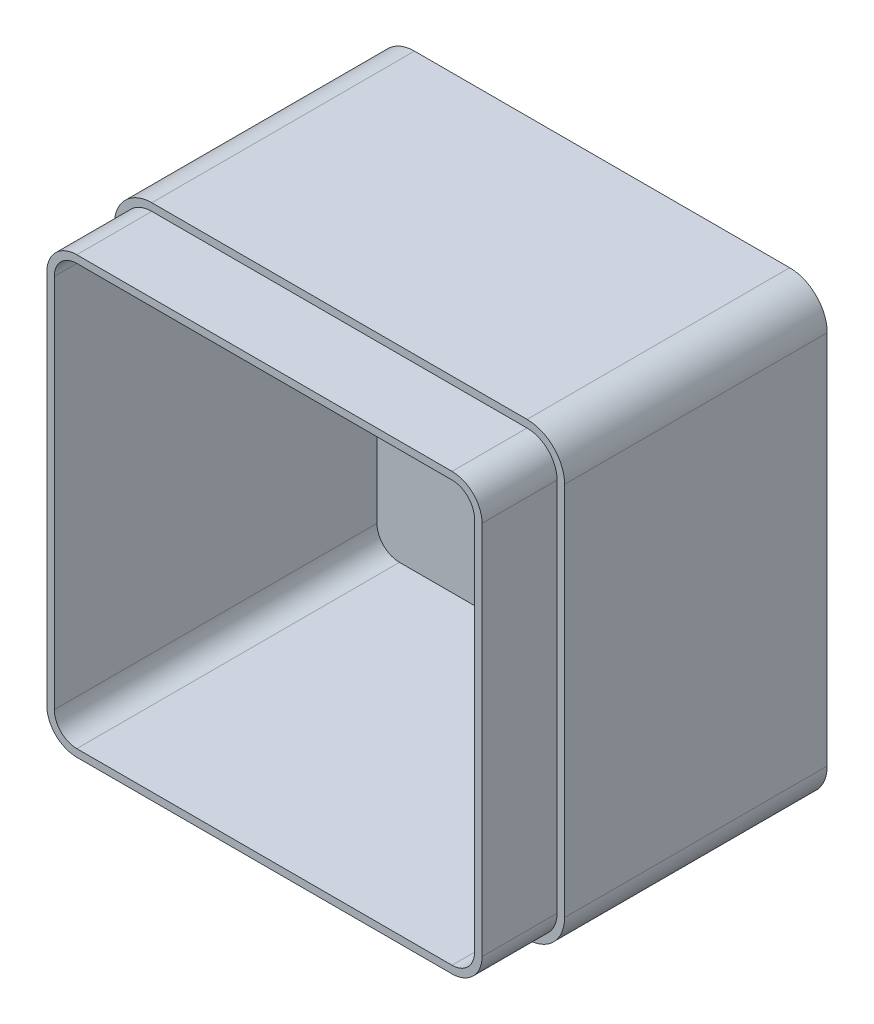
ISO-10303-21;
HEADER;
FILE_DESCRIPTION(('STEP AP214'),'2;1');
FILE_NAME('part.step','',(''),(''),'','','');
FILE_SCHEMA(('AUTOMOTIVE_DESIGN { 1 0 10303 214 1 1 1 1 }'));
ENDSEC;
DATA;
#1=APPLICATION_CONTEXT('core data for automotive mechanical design processes');
#2=APPLICATION_PROTOCOL_DEFINITION('international standard','automotive_design',2000,#1);
#3=PRODUCT_CONTEXT('',#1,'mechanical');
#4=PRODUCT('Part','Part','',(#3));
#5=PRODUCT_RELATED_PRODUCT_CATEGORY('part','',(#4));
#6=PRODUCT_DEFINITION_FORMATION('','',#4);
#7=PRODUCT_DEFINITION_CONTEXT('part definition',#1,'design');
#8=PRODUCT_DEFINITION('design','',#6,#7);
#9=PRODUCT_DEFINITION_SHAPE('','',#8);
#10=(LENGTH_UNIT() NAMED_UNIT(*) SI_UNIT(.MILLI.,.METRE.));
#11=(NAMED_UNIT(*) PLANE_ANGLE_UNIT() SI_UNIT($,.RADIAN.));
#12=(NAMED_UNIT(*) SI_UNIT($,.STERADIAN.) SOLID_ANGLE_UNIT());
#13=UNCERTAINTY_MEASURE_WITH_UNIT(LENGTH_MEASURE(1.E-05),#10,'distance_accuracy_value','');
#14=(GEOMETRIC_REPRESENTATION_CONTEXT(3) GLOBAL_UNCERTAINTY_ASSIGNED_CONTEXT((#13)) GLOBAL_UNIT_ASSIGNED_CONTEXT((#10,
#11,#12)) REPRESENTATION_CONTEXT('',''));
#15=CARTESIAN_POINT('',(0.,0.,0.));
#16=DIRECTION('',(0.,0.,1.));
#17=DIRECTION('',(1.,0.,0.));
#18=AXIS2_PLACEMENT_3D('',#15,#16,#17);
#19=CARTESIAN_POINT('',(0.,0.,90.));
#20=DIRECTION('',(0.,0.,-1.));
#21=DIRECTION('',(-1.,0.,0.));
#22=AXIS2_PLACEMENT_3D('',#19,#20,#21);
#23=PLANE('',#22);
#24=DIRECTION('',(0.,-1.,0.));
#25=VECTOR('',#24,1.);
#26=CARTESIAN_POINT('',(4.,0.,90.));
#27=LINE('',#26,#25);
#28=CARTESIAN_POINT('',(4.,110.,90.));
#29=VERTEX_POINT('',#28);
#30=CARTESIAN_POINT('',(4.,9.99999999999999,90.));
#31=VERTEX_POINT('',#30);
#32=EDGE_CURVE('E347',#29,#31,#27,.T.);
#33=ORIENTED_EDGE('',*,*,#32,.F.);
#34=CARTESIAN_POINT('',(10.,110.,90.));
#35=DIRECTION('',(0.,0.,-1.));
#36=DIRECTION('',(-1.,0.,0.));
#37=AXIS2_PLACEMENT_3D('',#34,#35,#36);
#38=CIRCLE('',#37,6.);
#39=CARTESIAN_POINT('',(9.99999999999999,116.,90.));
#40=VERTEX_POINT('',#39);
#41=EDGE_CURVE('E387',#40,#29,#38,.F.);
#42=ORIENTED_EDGE('',*,*,#41,.F.);
#43=DIRECTION('',(-1.,0.,0.));
#44=VECTOR('',#43,1.);
#45=CARTESIAN_POINT('',(0.,116.,90.));
#46=LINE('',#45,#44);
#47=CARTESIAN_POINT('',(110.,116.,90.));
#48=VERTEX_POINT('',#47);
#49=EDGE_CURVE('E363',#48,#40,#46,.T.);
#50=ORIENTED_EDGE('',*,*,#49,.F.);
#51=CARTESIAN_POINT('',(110.,110.,90.));
#52=DIRECTION('',(0.,0.,-1.));
#53=DIRECTION('',(-1.,0.,0.));
#54=AXIS2_PLACEMENT_3D('',#51,#52,#53);
#55=CIRCLE('',#54,6.);
#56=CARTESIAN_POINT('',(116.,110.,90.));
#57=VERTEX_POINT('',#56);
#58=EDGE_CURVE('E327',#57,#48,#55,.F.);
#59=ORIENTED_EDGE('',*,*,#58,.F.);
#60=DIRECTION('',(0.,1.,0.));
#61=VECTOR('',#60,1.);
#62=CARTESIAN_POINT('',(116.,0.,90.));
#63=LINE('',#62,#61);
#64=CARTESIAN_POINT('',(116.,9.99999999999999,90.));
#65=VERTEX_POINT('',#64);
#66=EDGE_CURVE('E391',#65,#57,#63,.T.);
#67=ORIENTED_EDGE('',*,*,#66,.F.);
#68=CARTESIAN_POINT('',(110.,10.,90.));
#69=DIRECTION('',(0.,0.,-1.));
#70=DIRECTION('',(-1.,0.,0.));
#71=AXIS2_PLACEMENT_3D('',#68,#69,#70);
#72=CIRCLE('',#71,6.);
#73=CARTESIAN_POINT('',(110.,4.,90.));
#74=VERTEX_POINT('',#73);
#75=EDGE_CURVE('E392',#74,#65,#72,.F.);
#76=ORIENTED_EDGE('',*,*,#75,.F.);
#77=DIRECTION('',(1.,0.,0.));
#78=VECTOR('',#77,1.);
#79=CARTESIAN_POINT('',(0.,4.,90.));
#80=LINE('',#79,#78);
#81=CARTESIAN_POINT('',(9.99999999999999,4.,90.));
#82=VERTEX_POINT('',#81);
#83=EDGE_CURVE('E384',#82,#74,#80,.T.);
#84=ORIENTED_EDGE('',*,*,#83,.F.);
#85=CARTESIAN_POINT('',(10.,10.,90.));
#86=DIRECTION('',(0.,0.,-1.));
#87=DIRECTION('',(-1.,0.,0.));
#88=AXIS2_PLACEMENT_3D('',#85,#86,#87);
#89=CIRCLE('',#88,6.);
#90=EDGE_CURVE('E377',#31,#82,#89,.F.);
#91=ORIENTED_EDGE('',*,*,#90,.F.);
#92=EDGE_LOOP('',(#33,#42,#50,#59,#67,#76,#84,#91));
#93=FACE_BOUND('',#92,.T.);
#94=CARTESIAN_POINT('',(10.,110.,90.));
#95=DIRECTION('',(0.,0.,1.));
#96=DIRECTION('',(1.,0.,0.));
#97=AXIS2_PLACEMENT_3D('',#94,#95,#96);
#98=CIRCLE('',#97,8.);
#99=CARTESIAN_POINT('',(9.99999999999999,118.,90.));
#100=VERTEX_POINT('',#99);
#101=CARTESIAN_POINT('',(2.,110.,90.));
#102=VERTEX_POINT('',#101);
#103=EDGE_CURVE('E255',#100,#102,#98,.T.);
#104=ORIENTED_EDGE('',*,*,#103,.T.);
#105=DIRECTION('',(0.,-1.,0.));
#106=VECTOR('',#105,1.);
#107=CARTESIAN_POINT('',(2.,110.,90.));
#108=LINE('',#107,#106);
#109=CARTESIAN_POINT('',(2.,9.99999999999999,90.));
#110=VERTEX_POINT('',#109);
#111=EDGE_CURVE('E205',#102,#110,#108,.T.);
#112=ORIENTED_EDGE('',*,*,#111,.T.);
#113=CARTESIAN_POINT('',(10.,10.,90.));
#114=DIRECTION('',(0.,0.,1.));
#115=DIRECTION('',(1.,0.,0.));
#116=AXIS2_PLACEMENT_3D('',#113,#114,#115);
#117=CIRCLE('',#116,8.);
#118=CARTESIAN_POINT('',(9.99999999999999,2.,90.));
#119=VERTEX_POINT('',#118);
#120=EDGE_CURVE('E54',#110,#119,#117,.T.);
#121=ORIENTED_EDGE('',*,*,#120,.T.);
#122=DIRECTION('',(1.,0.,0.));
#123=VECTOR('',#122,1.);
#124=CARTESIAN_POINT('',(9.99999999999999,2.,90.));
#125=LINE('',#124,#123);
#126=CARTESIAN_POINT('',(110.,2.,90.));
#127=VERTEX_POINT('',#126);
#128=EDGE_CURVE('E262',#119,#127,#125,.T.);
#129=ORIENTED_EDGE('',*,*,#128,.T.);
#130=CARTESIAN_POINT('',(110.,10.,90.));
#131=DIRECTION('',(0.,0.,1.));
#132=DIRECTION('',(1.,0.,0.));
#133=AXIS2_PLACEMENT_3D('',#130,#131,#132);
#134=CIRCLE('',#133,7.99999999999999);
#135=CARTESIAN_POINT('',(118.,10.,90.));
#136=VERTEX_POINT('',#135);
#137=EDGE_CURVE('E266',#127,#136,#134,.T.);
#138=ORIENTED_EDGE('',*,*,#137,.T.);
#139=DIRECTION('',(0.,1.,0.));
#140=VECTOR('',#139,1.);
#141=CARTESIAN_POINT('',(118.,9.99999999999999,90.));
#142=LINE('',#141,#140);
#143=CARTESIAN_POINT('',(118.,110.,90.));
#144=VERTEX_POINT('',#143);
#145=EDGE_CURVE('E270',#136,#144,#142,.T.);
#146=ORIENTED_EDGE('',*,*,#145,.T.);
#147=CARTESIAN_POINT('',(110.,110.,90.));
#148=DIRECTION('',(0.,0.,1.));
#149=DIRECTION('',(1.,0.,0.));
#150=AXIS2_PLACEMENT_3D('',#147,#148,#149);
#151=CIRCLE('',#150,7.99999999999999);
#152=CARTESIAN_POINT('',(110.,118.,90.));
#153=VERTEX_POINT('',#152);
#154=EDGE_CURVE('E232',#144,#153,#151,.T.);
#155=ORIENTED_EDGE('',*,*,#154,.T.);
#156=DIRECTION('',(-1.,0.,0.));
#157=VECTOR('',#156,1.);
#158=CARTESIAN_POINT('',(110.,118.,90.));
#159=LINE('',#158,#157);
#160=EDGE_CURVE('E228',#153,#100,#159,.T.);
#161=ORIENTED_EDGE('',*,*,#160,.T.);
#162=EDGE_LOOP('',(#104,#112,#121,#129,#138,#146,#155,#161));
#163=FACE_BOUND('',#162,.T.);
#164=ADVANCED_FACE('F38',(#93,#163),#23,.F.);
#165=CARTESIAN_POINT('',(4.,0.,90.));
#166=DIRECTION('',(1.,0.,0.));
#167=DIRECTION('',(0.,0.,-1.));
#168=AXIS2_PLACEMENT_3D('',#165,#166,#167);
#169=PLANE('',#168);
#170=DIRECTION('',(0.,-1.,0.));
#171=VECTOR('',#170,1.);
#172=CARTESIAN_POINT('',(4.,0.,4.));
#173=LINE('',#172,#171);
#174=CARTESIAN_POINT('',(4.,110.,4.));
#175=VERTEX_POINT('',#174);
#176=CARTESIAN_POINT('',(4.,9.99999999999999,4.));
#177=VERTEX_POINT('',#176);
#178=EDGE_CURVE('E319',#175,#177,#173,.T.);
#179=ORIENTED_EDGE('',*,*,#178,.F.);
#180=DIRECTION('',(0.,0.,-1.));
#181=VECTOR('',#180,1.);
#182=CARTESIAN_POINT('',(4.,110.,90.));
#183=LINE('',#182,#181);
#184=EDGE_CURVE('E328',#29,#175,#183,.T.);
#185=ORIENTED_EDGE('',*,*,#184,.F.);
#186=ORIENTED_EDGE('',*,*,#32,.T.);
#187=DIRECTION('',(0.,0.,-1.));
#188=VECTOR('',#187,1.);
#189=CARTESIAN_POINT('',(4.,9.99999999999999,90.));
#190=LINE('',#189,#188);
#191=EDGE_CURVE('E324',#177,#31,#190,.F.);
#192=ORIENTED_EDGE('',*,*,#191,.F.);
#193=EDGE_LOOP('',(#179,#185,#186,#192));
#194=FACE_BOUND('',#193,.T.);
#195=ADVANCED_FACE('F505',(#194),#169,.T.);
#196=CARTESIAN_POINT('',(0.,4.,90.));
#197=DIRECTION('',(0.,1.,0.));
#198=DIRECTION('',(0.,0.,1.));
#199=AXIS2_PLACEMENT_3D('',#196,#197,#198);
#200=PLANE('',#199);
#201=ORIENTED_EDGE('',*,*,#83,.T.);
#202=DIRECTION('',(0.,0.,1.));
#203=VECTOR('',#202,1.);
#204=CARTESIAN_POINT('',(110.,4.,90.));
#205=LINE('',#204,#203);
#206=CARTESIAN_POINT('',(110.,4.,4.));
#207=VERTEX_POINT('',#206);
#208=EDGE_CURVE('E360',#207,#74,#205,.T.);
#209=ORIENTED_EDGE('',*,*,#208,.F.);
#210=DIRECTION('',(1.,0.,0.));
#211=VECTOR('',#210,1.);
#212=CARTESIAN_POINT('',(0.,4.,4.));
#213=LINE('',#212,#211);
#214=CARTESIAN_POINT('',(9.99999999999999,4.,4.));
#215=VERTEX_POINT('',#214);
#216=EDGE_CURVE('E323',#215,#207,#213,.T.);
#217=ORIENTED_EDGE('',*,*,#216,.F.);
#218=DIRECTION('',(0.,0.,1.));
#219=VECTOR('',#218,1.);
#220=CARTESIAN_POINT('',(9.99999999999999,4.,90.));
#221=LINE('',#220,#219);
#222=EDGE_CURVE('E351',#82,#215,#221,.F.);
#223=ORIENTED_EDGE('',*,*,#222,.F.);
#224=EDGE_LOOP('',(#201,#209,#217,#223));
#225=FACE_BOUND('',#224,.T.);
#226=ADVANCED_FACE('F511',(#225),#200,.T.);
#227=CARTESIAN_POINT('',(116.,0.,90.));
#228=DIRECTION('',(-1.,0.,0.));
#229=DIRECTION('',(0.,0.,1.));
#230=AXIS2_PLACEMENT_3D('',#227,#228,#229);
#231=PLANE('',#230);
#232=ORIENTED_EDGE('',*,*,#66,.T.);
#233=DIRECTION('',(0.,0.,1.));
#234=VECTOR('',#233,1.);
#235=CARTESIAN_POINT('',(116.,110.,90.));
#236=LINE('',#235,#234);
#237=CARTESIAN_POINT('',(116.,110.,4.));
#238=VERTEX_POINT('',#237);
#239=EDGE_CURVE('E369',#238,#57,#236,.T.);
#240=ORIENTED_EDGE('',*,*,#239,.F.);
#241=DIRECTION('',(0.,1.,0.));
#242=VECTOR('',#241,1.);
#243=CARTESIAN_POINT('',(116.,0.,4.));
#244=LINE('',#243,#242);
#245=CARTESIAN_POINT('',(116.,9.99999999999999,4.));
#246=VERTEX_POINT('',#245);
#247=EDGE_CURVE('E336',#246,#238,#244,.T.);
#248=ORIENTED_EDGE('',*,*,#247,.F.);
#249=DIRECTION('',(0.,0.,1.));
#250=VECTOR('',#249,1.);
#251=CARTESIAN_POINT('',(116.,9.99999999999999,90.));
#252=LINE('',#251,#250);
#253=EDGE_CURVE('E364',#65,#246,#252,.F.);
#254=ORIENTED_EDGE('',*,*,#253,.F.);
#255=EDGE_LOOP('',(#232,#240,#248,#254));
#256=FACE_BOUND('',#255,.T.);
#257=ADVANCED_FACE('F540',(#256),#231,.T.);
#258=CARTESIAN_POINT('',(0.,116.,90.));
#259=DIRECTION('',(0.,-1.,0.));
#260=DIRECTION('',(0.,0.,-1.));
#261=AXIS2_PLACEMENT_3D('',#258,#259,#260);
#262=PLANE('',#261);
#263=DIRECTION('',(-1.,0.,0.));
#264=VECTOR('',#263,1.);
#265=CARTESIAN_POINT('',(0.,116.,4.));
#266=LINE('',#265,#264);
#267=CARTESIAN_POINT('',(110.,116.,4.));
#268=VERTEX_POINT('',#267);
#269=CARTESIAN_POINT('',(9.99999999999999,116.,4.));
#270=VERTEX_POINT('',#269);
#271=EDGE_CURVE('E343',#268,#270,#266,.T.);
#272=ORIENTED_EDGE('',*,*,#271,.F.);
#273=DIRECTION('',(0.,0.,-1.));
#274=VECTOR('',#273,1.);
#275=CARTESIAN_POINT('',(110.,116.,90.));
#276=LINE('',#275,#274);
#277=EDGE_CURVE('E373',#48,#268,#276,.T.);
#278=ORIENTED_EDGE('',*,*,#277,.F.);
#279=ORIENTED_EDGE('',*,*,#49,.T.);
#280=DIRECTION('',(0.,0.,-1.));
#281=VECTOR('',#280,1.);
#282=CARTESIAN_POINT('',(9.99999999999999,116.,90.));
#283=LINE('',#282,#281);
#284=EDGE_CURVE('E372',#270,#40,#283,.F.);
#285=ORIENTED_EDGE('',*,*,#284,.F.);
#286=EDGE_LOOP('',(#272,#278,#279,#285));
#287=FACE_BOUND('',#286,.T.);
#288=ADVANCED_FACE('F536',(#287),#262,.T.);
#289=CARTESIAN_POINT('',(0.,0.,4.));
#290=DIRECTION('',(0.,0.,-1.));
#291=DIRECTION('',(-1.,0.,0.));
#292=AXIS2_PLACEMENT_3D('',#289,#290,#291);
#293=PLANE('',#292);
#294=ORIENTED_EDGE('',*,*,#216,.T.);
#295=CARTESIAN_POINT('',(110.,10.,4.));
#296=DIRECTION('',(0.,0.,-1.));
#297=DIRECTION('',(-1.,0.,0.));
#298=AXIS2_PLACEMENT_3D('',#295,#296,#297);
#299=CIRCLE('',#298,6.);
#300=EDGE_CURVE('E342',#246,#207,#299,.T.);
#301=ORIENTED_EDGE('',*,*,#300,.F.);
#302=ORIENTED_EDGE('',*,*,#247,.T.);
#303=CARTESIAN_POINT('',(110.,110.,4.));
#304=DIRECTION('',(0.,0.,-1.));
#305=DIRECTION('',(-1.,0.,0.));
#306=AXIS2_PLACEMENT_3D('',#303,#304,#305);
#307=CIRCLE('',#306,6.);
#308=EDGE_CURVE('E348',#268,#238,#307,.T.);
#309=ORIENTED_EDGE('',*,*,#308,.F.);
#310=ORIENTED_EDGE('',*,*,#271,.T.);
#311=CARTESIAN_POINT('',(10.,110.,4.));
#312=DIRECTION('',(0.,0.,-1.));
#313=DIRECTION('',(-1.,0.,0.));
#314=AXIS2_PLACEMENT_3D('',#311,#312,#313);
#315=CIRCLE('',#314,6.);
#316=EDGE_CURVE('E339',#175,#270,#315,.T.);
#317=ORIENTED_EDGE('',*,*,#316,.F.);
#318=ORIENTED_EDGE('',*,*,#178,.T.);
#319=CARTESIAN_POINT('',(10.,10.,4.));
#320=DIRECTION('',(0.,0.,-1.));
#321=DIRECTION('',(-1.,0.,0.));
#322=AXIS2_PLACEMENT_3D('',#319,#320,#321);
#323=CIRCLE('',#322,6.);
#324=EDGE_CURVE('E332',#215,#177,#323,.T.);
#325=ORIENTED_EDGE('',*,*,#324,.F.);
#326=EDGE_LOOP('',(#294,#301,#302,#309,#310,#317,#318,#325));
#327=FACE_BOUND('',#326,.T.);
#328=ADVANCED_FACE('F532',(#327),#293,.F.);
#329=CARTESIAN_POINT('',(10.,10.,90.));
#330=DIRECTION('',(0.,0.,-1.));
#331=DIRECTION('',(-1.,0.,0.));
#332=AXIS2_PLACEMENT_3D('',#329,#330,#331);
#333=CYLINDRICAL_SURFACE('',#332,6.);
#334=ORIENTED_EDGE('',*,*,#90,.T.);
#335=ORIENTED_EDGE('',*,*,#222,.T.);
#336=ORIENTED_EDGE('',*,*,#324,.T.);
#337=ORIENTED_EDGE('',*,*,#191,.T.);
#338=EDGE_LOOP('',(#334,#335,#336,#337));
#339=FACE_BOUND('',#338,.T.);
#340=ADVANCED_FACE('F528',(#339),#333,.F.);
#341=CARTESIAN_POINT('',(10.,110.,90.));
#342=DIRECTION('',(0.,0.,-1.));
#343=DIRECTION('',(-1.,0.,0.));
#344=AXIS2_PLACEMENT_3D('',#341,#342,#343);
#345=CYLINDRICAL_SURFACE('',#344,6.);
#346=ORIENTED_EDGE('',*,*,#41,.T.);
#347=ORIENTED_EDGE('',*,*,#184,.T.);
#348=ORIENTED_EDGE('',*,*,#316,.T.);
#349=ORIENTED_EDGE('',*,*,#284,.T.);
#350=EDGE_LOOP('',(#346,#347,#348,#349));
#351=FACE_BOUND('',#350,.T.);
#352=ADVANCED_FACE('F524',(#351),#345,.F.);
#353=CARTESIAN_POINT('',(110.,10.,90.));
#354=DIRECTION('',(0.,0.,-1.));
#355=DIRECTION('',(-1.,0.,0.));
#356=AXIS2_PLACEMENT_3D('',#353,#354,#355);
#357=CYLINDRICAL_SURFACE('',#356,6.);
#358=ORIENTED_EDGE('',*,*,#75,.T.);
#359=ORIENTED_EDGE('',*,*,#253,.T.);
#360=ORIENTED_EDGE('',*,*,#300,.T.);
#361=ORIENTED_EDGE('',*,*,#208,.T.);
#362=EDGE_LOOP('',(#358,#359,#360,#361));
#363=FACE_BOUND('',#362,.T.);
#364=ADVANCED_FACE('F520',(#363),#357,.F.);
#365=CARTESIAN_POINT('',(110.,110.,90.));
#366=DIRECTION('',(0.,0.,-1.));
#367=DIRECTION('',(-1.,0.,0.));
#368=AXIS2_PLACEMENT_3D('',#365,#366,#367);
#369=CYLINDRICAL_SURFACE('',#368,6.);
#370=ORIENTED_EDGE('',*,*,#58,.T.);
#371=ORIENTED_EDGE('',*,*,#277,.T.);
#372=ORIENTED_EDGE('',*,*,#308,.T.);
#373=ORIENTED_EDGE('',*,*,#239,.T.);
#374=EDGE_LOOP('',(#370,#371,#372,#373));
#375=FACE_BOUND('',#374,.T.);
#376=ADVANCED_FACE('F517',(#375),#369,.F.);
#377=CARTESIAN_POINT('',(10.,110.,70.));
#378=DIRECTION('',(0.,0.,1.));
#379=DIRECTION('',(1.,0.,0.));
#380=AXIS2_PLACEMENT_3D('',#377,#378,#379);
#381=PLANE('',#380);
#382=DIRECTION('',(-1.,0.,0.));
#383=VECTOR('',#382,1.);
#384=CARTESIAN_POINT('',(110.,118.,70.));
#385=LINE('',#384,#383);
#386=CARTESIAN_POINT('',(110.,118.,70.));
#387=VERTEX_POINT('',#386);
#388=CARTESIAN_POINT('',(9.99999999999999,118.,70.));
#389=VERTEX_POINT('',#388);
#390=EDGE_CURVE('E212',#387,#389,#385,.T.);
#391=ORIENTED_EDGE('',*,*,#390,.F.);
#392=CARTESIAN_POINT('',(110.,110.,70.));
#393=DIRECTION('',(0.,0.,1.));
#394=DIRECTION('',(1.,0.,0.));
#395=AXIS2_PLACEMENT_3D('',#392,#393,#394);
#396=CIRCLE('',#395,7.99999999999999);
#397=CARTESIAN_POINT('',(118.,110.,70.));
#398=VERTEX_POINT('',#397);
#399=EDGE_CURVE('E249',#398,#387,#396,.T.);
#400=ORIENTED_EDGE('',*,*,#399,.F.);
#401=DIRECTION('',(0.,1.,0.));
#402=VECTOR('',#401,1.);
#403=CARTESIAN_POINT('',(118.,9.99999999999999,70.));
#404=LINE('',#403,#402);
#405=CARTESIAN_POINT('',(118.,10.,70.));
#406=VERTEX_POINT('',#405);
#407=EDGE_CURVE('E245',#406,#398,#404,.T.);
#408=ORIENTED_EDGE('',*,*,#407,.F.);
#409=CARTESIAN_POINT('',(110.,10.,70.));
#410=DIRECTION('',(0.,0.,1.));
#411=DIRECTION('',(1.,0.,0.));
#412=AXIS2_PLACEMENT_3D('',#409,#410,#411);
#413=CIRCLE('',#412,7.99999999999999);
#414=CARTESIAN_POINT('',(110.,2.,70.));
#415=VERTEX_POINT('',#414);
#416=EDGE_CURVE('E241',#415,#406,#413,.T.);
#417=ORIENTED_EDGE('',*,*,#416,.F.);
#418=DIRECTION('',(1.,0.,0.));
#419=VECTOR('',#418,1.);
#420=CARTESIAN_POINT('',(9.99999999999999,2.,70.));
#421=LINE('',#420,#419);
#422=CARTESIAN_POINT('',(9.99999999999999,2.,70.));
#423=VERTEX_POINT('',#422);
#424=EDGE_CURVE('E237',#423,#415,#421,.T.);
#425=ORIENTED_EDGE('',*,*,#424,.F.);
#426=CARTESIAN_POINT('',(10.,10.,70.));
#427=DIRECTION('',(0.,0.,1.));
#428=DIRECTION('',(1.,0.,0.));
#429=AXIS2_PLACEMENT_3D('',#426,#427,#428);
#430=CIRCLE('',#429,8.);
#431=CARTESIAN_POINT('',(2.,9.99999999999999,70.));
#432=VERTEX_POINT('',#431);
#433=EDGE_CURVE('E222',#432,#423,#430,.T.);
#434=ORIENTED_EDGE('',*,*,#433,.F.);
#435=DIRECTION('',(0.,-1.,0.));
#436=VECTOR('',#435,1.);
#437=CARTESIAN_POINT('',(2.,110.,70.));
#438=LINE('',#437,#436);
#439=CARTESIAN_POINT('',(2.,110.,70.));
#440=VERTEX_POINT('',#439);
#441=EDGE_CURVE('E203',#440,#432,#438,.T.);
#442=ORIENTED_EDGE('',*,*,#441,.F.);
#443=CARTESIAN_POINT('',(10.,110.,70.));
#444=DIRECTION('',(0.,0.,1.));
#445=DIRECTION('',(1.,0.,0.));
#446=AXIS2_PLACEMENT_3D('',#443,#444,#445);
#447=CIRCLE('',#446,8.);
#448=EDGE_CURVE('E218',#389,#440,#447,.T.);
#449=ORIENTED_EDGE('',*,*,#448,.F.);
#450=EDGE_LOOP('',(#391,#400,#408,#417,#425,#434,#442,#449));
#451=FACE_BOUND('',#450,.T.);
#452=CARTESIAN_POINT('',(10.,110.,70.));
#453=DIRECTION('',(0.,0.,1.));
#454=DIRECTION('',(1.,0.,0.));
#455=AXIS2_PLACEMENT_3D('',#452,#453,#454);
#456=CIRCLE('',#455,10.);
#457=CARTESIAN_POINT('',(10.,120.,70.));
#458=VERTEX_POINT('',#457);
#459=CARTESIAN_POINT('',(0.,110.,70.));
#460=VERTEX_POINT('',#459);
#461=EDGE_CURVE('E279',#458,#460,#456,.T.);
#462=ORIENTED_EDGE('',*,*,#461,.T.);
#463=DIRECTION('',(0.,-1.,0.));
#464=VECTOR('',#463,1.);
#465=CARTESIAN_POINT('',(0.,110.,70.));
#466=LINE('',#465,#464);
#467=CARTESIAN_POINT('',(0.,10.,70.));
#468=VERTEX_POINT('',#467);
#469=EDGE_CURVE('E299',#460,#468,#466,.T.);
#470=ORIENTED_EDGE('',*,*,#469,.T.);
#471=CARTESIAN_POINT('',(10.,10.,70.));
#472=DIRECTION('',(0.,0.,1.));
#473=DIRECTION('',(1.,0.,0.));
#474=AXIS2_PLACEMENT_3D('',#471,#472,#473);
#475=CIRCLE('',#474,10.);
#476=CARTESIAN_POINT('',(9.99999999999999,0.,70.));
#477=VERTEX_POINT('',#476);
#478=EDGE_CURVE('E302',#468,#477,#475,.T.);
#479=ORIENTED_EDGE('',*,*,#478,.T.);
#480=DIRECTION('',(1.,0.,0.));
#481=VECTOR('',#480,1.);
#482=CARTESIAN_POINT('',(9.99999999999999,0.,70.));
#483=LINE('',#482,#481);
#484=CARTESIAN_POINT('',(110.,0.,70.));
#485=VERTEX_POINT('',#484);
#486=EDGE_CURVE('E305',#477,#485,#483,.T.);
#487=ORIENTED_EDGE('',*,*,#486,.T.);
#488=CARTESIAN_POINT('',(110.,10.,70.));
#489=DIRECTION('',(0.,0.,1.));
#490=DIRECTION('',(1.,0.,0.));
#491=AXIS2_PLACEMENT_3D('',#488,#489,#490);
#492=CIRCLE('',#491,9.99999999999999);
#493=CARTESIAN_POINT('',(120.,10.,70.));
#494=VERTEX_POINT('',#493);
#495=EDGE_CURVE('E308',#485,#494,#492,.T.);
#496=ORIENTED_EDGE('',*,*,#495,.T.);
#497=DIRECTION('',(0.,1.,0.));
#498=VECTOR('',#497,1.);
#499=CARTESIAN_POINT('',(120.,10.,70.));
#500=LINE('',#499,#498);
#501=CARTESIAN_POINT('',(120.,110.,70.));
#502=VERTEX_POINT('',#501);
#503=EDGE_CURVE('E62',#494,#502,#500,.T.);
#504=ORIENTED_EDGE('',*,*,#503,.T.);
#505=CARTESIAN_POINT('',(110.,110.,70.));
#506=DIRECTION('',(0.,0.,1.));
#507=DIRECTION('',(1.,0.,0.));
#508=AXIS2_PLACEMENT_3D('',#505,#506,#507);
#509=CIRCLE('',#508,9.99999999999999);
#510=CARTESIAN_POINT('',(110.,120.,70.));
#511=VERTEX_POINT('',#510);
#512=EDGE_CURVE('E313',#502,#511,#509,.T.);
#513=ORIENTED_EDGE('',*,*,#512,.T.);
#514=DIRECTION('',(-1.,0.,0.));
#515=VECTOR('',#514,1.);
#516=CARTESIAN_POINT('',(110.,120.,70.));
#517=LINE('',#516,#515);
#518=EDGE_CURVE('E316',#511,#458,#517,.T.);
#519=ORIENTED_EDGE('',*,*,#518,.T.);
#520=EDGE_LOOP('',(#462,#470,#479,#487,#496,#504,#513,#519));
#521=FACE_BOUND('',#520,.T.);
#522=ADVANCED_FACE('F217',(#451,#521),#381,.T.);
#523=CARTESIAN_POINT('',(10.,110.,70.));
#524=DIRECTION('',(0.,0.,1.));
#525=DIRECTION('',(1.,0.,0.));
#526=AXIS2_PLACEMENT_3D('',#523,#524,#525);
#527=CYLINDRICAL_SURFACE('',#526,8.);
#528=ORIENTED_EDGE('',*,*,#103,.F.);
#529=DIRECTION('',(0.,0.,1.));
#530=VECTOR('',#529,1.);
#531=CARTESIAN_POINT('',(9.99999999999999,118.,70.));
#532=LINE('',#531,#530);
#533=EDGE_CURVE('E226',#389,#100,#532,.T.);
#534=ORIENTED_EDGE('',*,*,#533,.F.);
#535=ORIENTED_EDGE('',*,*,#448,.T.);
#536=DIRECTION('',(0.,0.,1.));
#537=VECTOR('',#536,1.);
#538=CARTESIAN_POINT('',(2.,110.,70.));
#539=LINE('',#538,#537);
#540=EDGE_CURVE('E200',#440,#102,#539,.T.);
#541=ORIENTED_EDGE('',*,*,#540,.T.);
#542=EDGE_LOOP('',(#528,#534,#535,#541));
#543=FACE_BOUND('',#542,.T.);
#544=ADVANCED_FACE('F225',(#543),#527,.T.);
#545=CARTESIAN_POINT('',(110.,118.,70.));
#546=DIRECTION('',(0.,1.,0.));
#547=DIRECTION('',(0.,0.,1.));
#548=AXIS2_PLACEMENT_3D('',#545,#546,#547);
#549=PLANE('',#548);
#550=ORIENTED_EDGE('',*,*,#160,.F.);
#551=DIRECTION('',(0.,0.,1.));
#552=VECTOR('',#551,1.);
#553=CARTESIAN_POINT('',(110.,118.,70.));
#554=LINE('',#553,#552);
#555=EDGE_CURVE('E280',#387,#153,#554,.T.);
#556=ORIENTED_EDGE('',*,*,#555,.F.);
#557=ORIENTED_EDGE('',*,*,#390,.T.);
#558=ORIENTED_EDGE('',*,*,#533,.T.);
#559=EDGE_LOOP('',(#550,#556,#557,#558));
#560=FACE_BOUND('',#559,.T.);
#561=ADVANCED_FACE('F551',(#560),#549,.T.);
#562=CARTESIAN_POINT('',(110.,110.,70.));
#563=DIRECTION('',(0.,0.,1.));
#564=DIRECTION('',(1.,0.,0.));
#565=AXIS2_PLACEMENT_3D('',#562,#563,#564);
#566=CYLINDRICAL_SURFACE('',#565,7.99999999999999);
#567=ORIENTED_EDGE('',*,*,#154,.F.);
#568=DIRECTION('',(0.,0.,1.));
#569=VECTOR('',#568,1.);
#570=CARTESIAN_POINT('',(118.,110.,70.));
#571=LINE('',#570,#569);
#572=EDGE_CURVE('E283',#398,#144,#571,.T.);
#573=ORIENTED_EDGE('',*,*,#572,.F.);
#574=ORIENTED_EDGE('',*,*,#399,.T.);
#575=ORIENTED_EDGE('',*,*,#555,.T.);
#576=EDGE_LOOP('',(#567,#573,#574,#575));
#577=FACE_BOUND('',#576,.T.);
#578=ADVANCED_FACE('F566',(#577),#566,.T.);
#579=CARTESIAN_POINT('',(118.,9.99999999999999,70.));
#580=DIRECTION('',(1.,0.,0.));
#581=DIRECTION('',(0.,0.,-1.));
#582=AXIS2_PLACEMENT_3D('',#579,#580,#581);
#583=PLANE('',#582);
#584=ORIENTED_EDGE('',*,*,#145,.F.);
#585=DIRECTION('',(0.,0.,1.));
#586=VECTOR('',#585,1.);
#587=CARTESIAN_POINT('',(118.,10.,70.));
#588=LINE('',#587,#586);
#589=EDGE_CURVE('E286',#406,#136,#588,.T.);
#590=ORIENTED_EDGE('',*,*,#589,.F.);
#591=ORIENTED_EDGE('',*,*,#407,.T.);
#592=ORIENTED_EDGE('',*,*,#572,.T.);
#593=EDGE_LOOP('',(#584,#590,#591,#592));
#594=FACE_BOUND('',#593,.T.);
#595=ADVANCED_FACE('F562',(#594),#583,.T.);
#596=CARTESIAN_POINT('',(110.,10.,70.));
#597=DIRECTION('',(0.,0.,1.));
#598=DIRECTION('',(1.,0.,0.));
#599=AXIS2_PLACEMENT_3D('',#596,#597,#598);
#600=CYLINDRICAL_SURFACE('',#599,7.99999999999999);
#601=ORIENTED_EDGE('',*,*,#137,.F.);
#602=DIRECTION('',(0.,0.,1.));
#603=VECTOR('',#602,1.);
#604=CARTESIAN_POINT('',(110.,2.,70.));
#605=LINE('',#604,#603);
#606=EDGE_CURVE('E289',#415,#127,#605,.T.);
#607=ORIENTED_EDGE('',*,*,#606,.F.);
#608=ORIENTED_EDGE('',*,*,#416,.T.);
#609=ORIENTED_EDGE('',*,*,#589,.T.);
#610=EDGE_LOOP('',(#601,#607,#608,#609));
#611=FACE_BOUND('',#610,.T.);
#612=ADVANCED_FACE('F558',(#611),#600,.T.);
#613=CARTESIAN_POINT('',(9.99999999999999,2.,70.));
#614=DIRECTION('',(0.,-1.,0.));
#615=DIRECTION('',(0.,0.,-1.));
#616=AXIS2_PLACEMENT_3D('',#613,#614,#615);
#617=PLANE('',#616);
#618=ORIENTED_EDGE('',*,*,#128,.F.);
#619=DIRECTION('',(0.,0.,1.));
#620=VECTOR('',#619,1.);
#621=CARTESIAN_POINT('',(9.99999999999999,2.,70.));
#622=LINE('',#621,#620);
#623=EDGE_CURVE('E292',#423,#119,#622,.T.);
#624=ORIENTED_EDGE('',*,*,#623,.F.);
#625=ORIENTED_EDGE('',*,*,#424,.T.);
#626=ORIENTED_EDGE('',*,*,#606,.T.);
#627=EDGE_LOOP('',(#618,#624,#625,#626));
#628=FACE_BOUND('',#627,.T.);
#629=ADVANCED_FACE('F555',(#628),#617,.T.);
#630=CARTESIAN_POINT('',(10.,10.,70.));
#631=DIRECTION('',(0.,0.,1.));
#632=DIRECTION('',(1.,0.,0.));
#633=AXIS2_PLACEMENT_3D('',#630,#631,#632);
#634=CYLINDRICAL_SURFACE('',#633,8.);
#635=ORIENTED_EDGE('',*,*,#120,.F.);
#636=DIRECTION('',(0.,0.,1.));
#637=VECTOR('',#636,1.);
#638=CARTESIAN_POINT('',(2.,9.99999999999999,70.));
#639=LINE('',#638,#637);
#640=EDGE_CURVE('E211',#432,#110,#639,.T.);
#641=ORIENTED_EDGE('',*,*,#640,.F.);
#642=ORIENTED_EDGE('',*,*,#433,.T.);
#643=ORIENTED_EDGE('',*,*,#623,.T.);
#644=EDGE_LOOP('',(#635,#641,#642,#643));
#645=FACE_BOUND('',#644,.T.);
#646=ADVANCED_FACE('F500',(#645),#634,.T.);
#647=CARTESIAN_POINT('',(2.,110.,70.));
#648=DIRECTION('',(-1.,0.,0.));
#649=DIRECTION('',(0.,0.,1.));
#650=AXIS2_PLACEMENT_3D('',#647,#648,#649);
#651=PLANE('',#650);
#652=ORIENTED_EDGE('',*,*,#111,.F.);
#653=ORIENTED_EDGE('',*,*,#540,.F.);
#654=ORIENTED_EDGE('',*,*,#441,.T.);
#655=ORIENTED_EDGE('',*,*,#640,.T.);
#656=EDGE_LOOP('',(#652,#653,#654,#655));
#657=FACE_BOUND('',#656,.T.);
#658=ADVANCED_FACE('F202',(#657),#651,.T.);
#659=CARTESIAN_POINT('',(0.,0.,0.));
#660=DIRECTION('',(0.,0.,-1.));
#661=DIRECTION('',(-1.,0.,0.));
#662=AXIS2_PLACEMENT_3D('',#659,#660,#661);
#663=PLANE('',#662);
#664=DIRECTION('',(1.,0.,0.));
#665=VECTOR('',#664,1.);
#666=CARTESIAN_POINT('',(0.,0.,0.));
#667=LINE('',#666,#665);
#668=CARTESIAN_POINT('',(10.,0.,0.));
#669=VERTEX_POINT('',#668);
#670=CARTESIAN_POINT('',(110.,0.,0.));
#671=VERTEX_POINT('',#670);
#672=EDGE_CURVE('E407',#669,#671,#667,.T.);
#673=ORIENTED_EDGE('',*,*,#672,.F.);
#674=CARTESIAN_POINT('',(10.,10.,0.));
#675=DIRECTION('',(0.,0.,-1.));
#676=DIRECTION('',(-1.,0.,0.));
#677=AXIS2_PLACEMENT_3D('',#674,#675,#676);
#678=CIRCLE('',#677,10.);
#679=CARTESIAN_POINT('',(0.,10.,0.));
#680=VERTEX_POINT('',#679);
#681=EDGE_CURVE('E435',#669,#680,#678,.T.);
#682=ORIENTED_EDGE('',*,*,#681,.T.);
#683=DIRECTION('',(0.,-1.,0.));
#684=VECTOR('',#683,1.);
#685=CARTESIAN_POINT('',(0.,0.,0.));
#686=LINE('',#685,#684);
#687=CARTESIAN_POINT('',(0.,110.,0.));
#688=VERTEX_POINT('',#687);
#689=EDGE_CURVE('E368',#688,#680,#686,.T.);
#690=ORIENTED_EDGE('',*,*,#689,.F.);
#691=CARTESIAN_POINT('',(10.,110.,0.));
#692=DIRECTION('',(0.,0.,-1.));
#693=DIRECTION('',(-1.,0.,0.));
#694=AXIS2_PLACEMENT_3D('',#691,#692,#693);
#695=CIRCLE('',#694,10.);
#696=CARTESIAN_POINT('',(10.,120.,0.));
#697=VERTEX_POINT('',#696);
#698=EDGE_CURVE('E432',#688,#697,#695,.T.);
#699=ORIENTED_EDGE('',*,*,#698,.T.);
#700=DIRECTION('',(-1.,0.,0.));
#701=VECTOR('',#700,1.);
#702=CARTESIAN_POINT('',(0.,120.,0.));
#703=LINE('',#702,#701);
#704=CARTESIAN_POINT('',(110.,120.,0.));
#705=VERTEX_POINT('',#704);
#706=EDGE_CURVE('E415',#705,#697,#703,.T.);
#707=ORIENTED_EDGE('',*,*,#706,.F.);
#708=CARTESIAN_POINT('',(110.,110.,0.));
#709=DIRECTION('',(0.,0.,-1.));
#710=DIRECTION('',(-1.,0.,0.));
#711=AXIS2_PLACEMENT_3D('',#708,#709,#710);
#712=CIRCLE('',#711,10.);
#713=CARTESIAN_POINT('',(120.,110.,0.));
#714=VERTEX_POINT('',#713);
#715=EDGE_CURVE('E426',#705,#714,#712,.T.);
#716=ORIENTED_EDGE('',*,*,#715,.T.);
#717=DIRECTION('',(0.,1.,0.));
#718=VECTOR('',#717,1.);
#719=CARTESIAN_POINT('',(120.,0.,0.));
#720=LINE('',#719,#718);
#721=CARTESIAN_POINT('',(120.,10.,0.));
#722=VERTEX_POINT('',#721);
#723=EDGE_CURVE('E411',#722,#714,#720,.T.);
#724=ORIENTED_EDGE('',*,*,#723,.F.);
#725=CARTESIAN_POINT('',(110.,10.,0.));
#726=DIRECTION('',(0.,0.,-1.));
#727=DIRECTION('',(-1.,0.,0.));
#728=AXIS2_PLACEMENT_3D('',#725,#726,#727);
#729=CIRCLE('',#728,10.);
#730=EDGE_CURVE('E429',#722,#671,#729,.T.);
#731=ORIENTED_EDGE('',*,*,#730,.T.);
#732=EDGE_LOOP('',(#673,#682,#690,#699,#707,#716,#724,#731));
#733=FACE_BOUND('',#732,.T.);
#734=ADVANCED_FACE('F491',(#733),#663,.T.);
#735=CARTESIAN_POINT('',(10.,110.,90.));
#736=DIRECTION('',(0.,0.,-1.));
#737=DIRECTION('',(-1.,0.,0.));
#738=AXIS2_PLACEMENT_3D('',#735,#736,#737);
#739=CYLINDRICAL_SURFACE('',#738,10.);
#740=DIRECTION('',(0.,0.,-1.));
#741=VECTOR('',#740,1.);
#742=CARTESIAN_POINT('',(0.,110.,90.));
#743=LINE('',#742,#741);
#744=EDGE_CURVE('E438',#460,#688,#743,.T.);
#745=ORIENTED_EDGE('',*,*,#744,.F.);
#746=ORIENTED_EDGE('',*,*,#461,.F.);
#747=DIRECTION('',(0.,0.,-1.));
#748=VECTOR('',#747,1.);
#749=CARTESIAN_POINT('',(10.,120.,90.));
#750=LINE('',#749,#748);
#751=EDGE_CURVE('E448',#697,#458,#750,.F.);
#752=ORIENTED_EDGE('',*,*,#751,.F.);
#753=ORIENTED_EDGE('',*,*,#698,.F.);
#754=EDGE_LOOP('',(#745,#746,#752,#753));
#755=FACE_BOUND('',#754,.T.);
#756=ADVANCED_FACE('F470',(#755),#739,.T.);
#757=CARTESIAN_POINT('',(110.,110.,90.));
#758=DIRECTION('',(0.,0.,-1.));
#759=DIRECTION('',(-1.,0.,0.));
#760=AXIS2_PLACEMENT_3D('',#757,#758,#759);
#761=CYLINDRICAL_SURFACE('',#760,10.);
#762=DIRECTION('',(0.,0.,-1.));
#763=VECTOR('',#762,1.);
#764=CARTESIAN_POINT('',(110.,120.,90.));
#765=LINE('',#764,#763);
#766=EDGE_CURVE('E445',#511,#705,#765,.T.);
#767=ORIENTED_EDGE('',*,*,#766,.F.);
#768=ORIENTED_EDGE('',*,*,#512,.F.);
#769=DIRECTION('',(0.,0.,-1.));
#770=VECTOR('',#769,1.);
#771=CARTESIAN_POINT('',(120.,110.,90.));
#772=LINE('',#771,#770);
#773=EDGE_CURVE('E47',#714,#502,#772,.F.);
#774=ORIENTED_EDGE('',*,*,#773,.F.);
#775=ORIENTED_EDGE('',*,*,#715,.F.);
#776=EDGE_LOOP('',(#767,#768,#774,#775));
#777=FACE_BOUND('',#776,.T.);
#778=ADVANCED_FACE('F40',(#777),#761,.T.);
#779=CARTESIAN_POINT('',(0.,120.,90.));
#780=DIRECTION('',(0.,-1.,0.));
#781=DIRECTION('',(0.,0.,-1.));
#782=AXIS2_PLACEMENT_3D('',#779,#780,#781);
#783=PLANE('',#782);
#784=ORIENTED_EDGE('',*,*,#518,.F.);
#785=ORIENTED_EDGE('',*,*,#766,.T.);
#786=ORIENTED_EDGE('',*,*,#706,.T.);
#787=ORIENTED_EDGE('',*,*,#751,.T.);
#788=EDGE_LOOP('',(#784,#785,#786,#787));
#789=FACE_BOUND('',#788,.T.);
#790=ADVANCED_FACE('F465',(#789),#783,.F.);
#791=CARTESIAN_POINT('',(110.,10.,90.));
#792=DIRECTION('',(0.,0.,-1.));
#793=DIRECTION('',(-1.,0.,0.));
#794=AXIS2_PLACEMENT_3D('',#791,#792,#793);
#795=CYLINDRICAL_SURFACE('',#794,10.);
#796=DIRECTION('',(0.,0.,-1.));
#797=VECTOR('',#796,1.);
#798=CARTESIAN_POINT('',(120.,10.,90.));
#799=LINE('',#798,#797);
#800=EDGE_CURVE('E11',#494,#722,#799,.T.);
#801=ORIENTED_EDGE('',*,*,#800,.F.);
#802=ORIENTED_EDGE('',*,*,#495,.F.);
#803=DIRECTION('',(0.,0.,-1.));
#804=VECTOR('',#803,1.);
#805=CARTESIAN_POINT('',(110.,0.,90.));
#806=LINE('',#805,#804);
#807=EDGE_CURVE('E419',#671,#485,#806,.F.);
#808=ORIENTED_EDGE('',*,*,#807,.F.);
#809=ORIENTED_EDGE('',*,*,#730,.F.);
#810=EDGE_LOOP('',(#801,#802,#808,#809));
#811=FACE_BOUND('',#810,.T.);
#812=ADVANCED_FACE('F489',(#811),#795,.T.);
#813=CARTESIAN_POINT('',(120.,0.,90.));
#814=DIRECTION('',(-1.,0.,0.));
#815=DIRECTION('',(0.,0.,1.));
#816=AXIS2_PLACEMENT_3D('',#813,#814,#815);
#817=PLANE('',#816);
#818=ORIENTED_EDGE('',*,*,#503,.F.);
#819=ORIENTED_EDGE('',*,*,#800,.T.);
#820=ORIENTED_EDGE('',*,*,#723,.T.);
#821=ORIENTED_EDGE('',*,*,#773,.T.);
#822=EDGE_LOOP('',(#818,#819,#820,#821));
#823=FACE_BOUND('',#822,.T.);
#824=ADVANCED_FACE('F455',(#823),#817,.F.);
#825=CARTESIAN_POINT('',(10.,10.,90.));
#826=DIRECTION('',(0.,0.,-1.));
#827=DIRECTION('',(-1.,0.,0.));
#828=AXIS2_PLACEMENT_3D('',#825,#826,#827);
#829=CYLINDRICAL_SURFACE('',#828,10.);
#830=DIRECTION('',(0.,0.,-1.));
#831=VECTOR('',#830,1.);
#832=CARTESIAN_POINT('',(10.,0.,90.));
#833=LINE('',#832,#831);
#834=EDGE_CURVE('E423',#477,#669,#833,.T.);
#835=ORIENTED_EDGE('',*,*,#834,.F.);
#836=ORIENTED_EDGE('',*,*,#478,.F.);
#837=DIRECTION('',(0.,0.,-1.));
#838=VECTOR('',#837,1.);
#839=CARTESIAN_POINT('',(0.,10.,90.));
#840=LINE('',#839,#838);
#841=EDGE_CURVE('E441',#680,#468,#840,.F.);
#842=ORIENTED_EDGE('',*,*,#841,.F.);
#843=ORIENTED_EDGE('',*,*,#681,.F.);
#844=EDGE_LOOP('',(#835,#836,#842,#843));
#845=FACE_BOUND('',#844,.T.);
#846=ADVANCED_FACE('F480',(#845),#829,.T.);
#847=CARTESIAN_POINT('',(0.,0.,90.));
#848=DIRECTION('',(0.,1.,0.));
#849=DIRECTION('',(0.,0.,1.));
#850=AXIS2_PLACEMENT_3D('',#847,#848,#849);
#851=PLANE('',#850);
#852=ORIENTED_EDGE('',*,*,#486,.F.);
#853=ORIENTED_EDGE('',*,*,#834,.T.);
#854=ORIENTED_EDGE('',*,*,#672,.T.);
#855=ORIENTED_EDGE('',*,*,#807,.T.);
#856=EDGE_LOOP('',(#852,#853,#854,#855));
#857=FACE_BOUND('',#856,.T.);
#858=ADVANCED_FACE('F485',(#857),#851,.F.);
#859=CARTESIAN_POINT('',(0.,0.,90.));
#860=DIRECTION('',(1.,0.,0.));
#861=DIRECTION('',(0.,0.,-1.));
#862=AXIS2_PLACEMENT_3D('',#859,#860,#861);
#863=PLANE('',#862);
#864=ORIENTED_EDGE('',*,*,#469,.F.);
#865=ORIENTED_EDGE('',*,*,#744,.T.);
#866=ORIENTED_EDGE('',*,*,#689,.T.);
#867=ORIENTED_EDGE('',*,*,#841,.T.);
#868=EDGE_LOOP('',(#864,#865,#866,#867));
#869=FACE_BOUND('',#868,.T.);
#870=ADVANCED_FACE('F475',(#869),#863,.F.);
#871=CLOSED_SHELL('',(#164,#195,#226,#257,#288,#328,#340,#352,#364,#376,#522,#544,#561,#578,
#595,#612,#629,#646,#658,#734,#756,#778,#790,#812,#824,#846,#858,#870));
#872=MANIFOLD_SOLID_BREP('B2',#871);
#873=ADVANCED_BREP_SHAPE_REPRESENTATION('',(#18,#872),#14);
#874=SHAPE_DEFINITION_REPRESENTATION(#9,#873);
ENDSEC;
END-ISO-10303-21;
